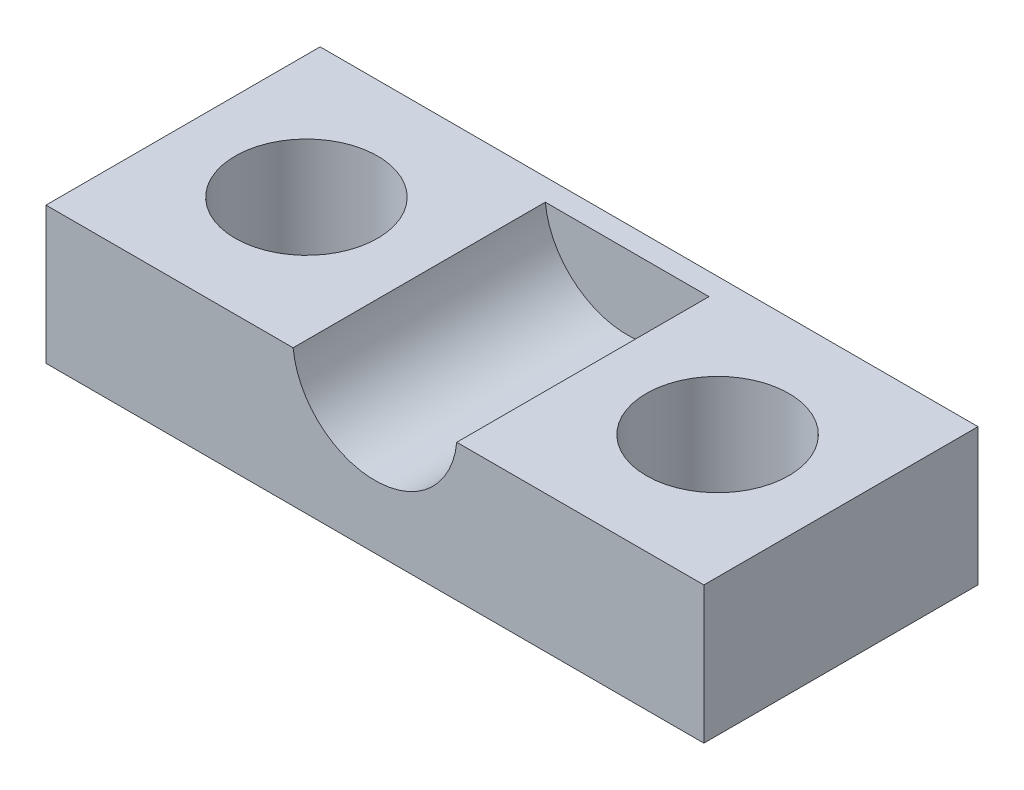
ISO-10303-21;
HEADER;
FILE_DESCRIPTION(('STEP AP214'),'2;1');
FILE_NAME('part.step','',(''),(''),'','','');
FILE_SCHEMA(('AUTOMOTIVE_DESIGN { 1 0 10303 214 1 1 1 1 }'));
ENDSEC;
DATA;
#1=APPLICATION_CONTEXT('core data for automotive mechanical design processes');
#2=APPLICATION_PROTOCOL_DEFINITION('international standard','automotive_design',2000,#1);
#3=PRODUCT_CONTEXT('',#1,'mechanical');
#4=PRODUCT('Part','Part','',(#3));
#5=PRODUCT_RELATED_PRODUCT_CATEGORY('part','',(#4));
#6=PRODUCT_DEFINITION_FORMATION('','',#4);
#7=PRODUCT_DEFINITION_CONTEXT('part definition',#1,'design');
#8=PRODUCT_DEFINITION('design','',#6,#7);
#9=PRODUCT_DEFINITION_SHAPE('','',#8);
#10=(LENGTH_UNIT() NAMED_UNIT(*) SI_UNIT(.MILLI.,.METRE.));
#11=(NAMED_UNIT(*) PLANE_ANGLE_UNIT() SI_UNIT($,.RADIAN.));
#12=(NAMED_UNIT(*) SI_UNIT($,.STERADIAN.) SOLID_ANGLE_UNIT());
#13=UNCERTAINTY_MEASURE_WITH_UNIT(LENGTH_MEASURE(1.E-05),#10,'distance_accuracy_value','');
#14=(GEOMETRIC_REPRESENTATION_CONTEXT(3) GLOBAL_UNCERTAINTY_ASSIGNED_CONTEXT((#13)) GLOBAL_UNIT_ASSIGNED_CONTEXT((#10,
#11,#12)) REPRESENTATION_CONTEXT('',''));
#15=CARTESIAN_POINT('',(0.,0.,0.));
#16=DIRECTION('',(0.,0.,1.));
#17=DIRECTION('',(1.,0.,0.));
#18=AXIS2_PLACEMENT_3D('',#15,#16,#17);
#19=CARTESIAN_POINT('',(0.,5.,0.));
#20=DIRECTION('',(0.,-1.,0.));
#21=DIRECTION('',(0.,0.,-1.));
#22=AXIS2_PLACEMENT_3D('',#19,#20,#21);
#23=PLANE('',#22);
#24=DIRECTION('',(-1.,0.,0.));
#25=VECTOR('',#24,1.);
#26=CARTESIAN_POINT('',(0.,5.,-9.2));
#27=LINE('',#26,#25);
#28=CARTESIAN_POINT('',(14.9849623113118,5.,-9.2));
#29=VERTEX_POINT('',#28);
#30=CARTESIAN_POINT('',(9.01503768866591,5.,-9.2));
#31=VERTEX_POINT('',#30);
#32=EDGE_CURVE('E11',#29,#31,#27,.T.);
#33=ORIENTED_EDGE('',*,*,#32,.F.);
#34=DIRECTION('',(0.,0.,1.));
#35=VECTOR('',#34,1.);
#36=CARTESIAN_POINT('',(14.9849623113118,5.,-9.2));
#37=LINE('',#36,#35);
#38=CARTESIAN_POINT('',(14.9849623113118,5.,0.));
#39=VERTEX_POINT('',#38);
#40=EDGE_CURVE('E101',#29,#39,#37,.T.);
#41=ORIENTED_EDGE('',*,*,#40,.T.);
#42=DIRECTION('',(1.,0.,0.));
#43=VECTOR('',#42,1.);
#44=CARTESIAN_POINT('',(0.,5.,0.));
#45=LINE('',#44,#43);
#46=CARTESIAN_POINT('',(24.,5.,0.));
#47=VERTEX_POINT('',#46);
#48=EDGE_CURVE('E124',#39,#47,#45,.T.);
#49=ORIENTED_EDGE('',*,*,#48,.T.);
#50=DIRECTION('',(0.,0.,-1.));
#51=VECTOR('',#50,1.);
#52=CARTESIAN_POINT('',(24.,5.,0.));
#53=LINE('',#52,#51);
#54=CARTESIAN_POINT('',(24.,5.,-10.));
#55=VERTEX_POINT('',#54);
#56=EDGE_CURVE('E126',#47,#55,#53,.T.);
#57=ORIENTED_EDGE('',*,*,#56,.T.);
#58=DIRECTION('',(-1.,0.,0.));
#59=VECTOR('',#58,1.);
#60=CARTESIAN_POINT('',(0.,5.,-10.));
#61=LINE('',#60,#59);
#62=CARTESIAN_POINT('',(0.,5.,-10.));
#63=VERTEX_POINT('',#62);
#64=EDGE_CURVE('E58',#55,#63,#61,.T.);
#65=ORIENTED_EDGE('',*,*,#64,.T.);
#66=DIRECTION('',(0.,0.,1.));
#67=VECTOR('',#66,1.);
#68=CARTESIAN_POINT('',(0.,5.,0.));
#69=LINE('',#68,#67);
#70=CARTESIAN_POINT('',(0.,5.,0.));
#71=VERTEX_POINT('',#70);
#72=EDGE_CURVE('E122',#63,#71,#69,.T.);
#73=ORIENTED_EDGE('',*,*,#72,.T.);
#74=CARTESIAN_POINT('',(9.01503768866591,5.,0.));
#75=VERTEX_POINT('',#74);
#76=EDGE_CURVE('E86',#71,#75,#45,.T.);
#77=ORIENTED_EDGE('',*,*,#76,.T.);
#78=DIRECTION('',(0.,0.,1.));
#79=VECTOR('',#78,1.);
#80=CARTESIAN_POINT('',(9.01503768866591,5.,-9.2));
#81=LINE('',#80,#79);
#82=EDGE_CURVE('E49',#75,#31,#81,.F.);
#83=ORIENTED_EDGE('',*,*,#82,.T.);
#84=EDGE_LOOP('',(#33,#41,#49,#57,#65,#73,#77,#83));
#85=FACE_BOUND('',#84,.T.);
#86=CARTESIAN_POINT('',(4.5,5.,-4.99999999999992));
#87=DIRECTION('',(0.,1.,0.));
#88=DIRECTION('',(0.,0.,1.));
#89=AXIS2_PLACEMENT_3D('',#86,#87,#88);
#90=CIRCLE('',#89,2.6);
#91=CARTESIAN_POINT('',(4.5,5.,-2.39999999999992));
#92=VERTEX_POINT('',#91);
#93=EDGE_CURVE('E116',#92,#92,#90,.T.);
#94=ORIENTED_EDGE('',*,*,#93,.F.);
#95=EDGE_LOOP('',(#94));
#96=FACE_BOUND('',#95,.T.);
#97=CARTESIAN_POINT('',(19.4999999999998,5.,-4.99999999999987));
#98=DIRECTION('',(0.,1.,0.));
#99=DIRECTION('',(0.,0.,1.));
#100=AXIS2_PLACEMENT_3D('',#97,#98,#99);
#101=CIRCLE('',#100,2.6);
#102=CARTESIAN_POINT('',(19.4999999999998,5.,-2.39999999999987));
#103=VERTEX_POINT('',#102);
#104=EDGE_CURVE('E110',#103,#103,#101,.T.);
#105=ORIENTED_EDGE('',*,*,#104,.F.);
#106=EDGE_LOOP('',(#105));
#107=FACE_BOUND('',#106,.T.);
#108=ADVANCED_FACE('F34',(#85,#96,#107),#23,.F.);
#109=CARTESIAN_POINT('',(0.,0.,0.));
#110=DIRECTION('',(0.,-1.,0.));
#111=DIRECTION('',(0.,0.,-1.));
#112=AXIS2_PLACEMENT_3D('',#109,#110,#111);
#113=PLANE('',#112);
#114=CARTESIAN_POINT('',(4.5,0.,-4.99999999999992));
#115=DIRECTION('',(0.,1.,0.));
#116=DIRECTION('',(0.,0.,1.));
#117=AXIS2_PLACEMENT_3D('',#114,#115,#116);
#118=CIRCLE('',#117,2.6);
#119=CARTESIAN_POINT('',(4.5,0.,-2.39999999999992));
#120=VERTEX_POINT('',#119);
#121=EDGE_CURVE('E113',#120,#120,#118,.T.);
#122=ORIENTED_EDGE('',*,*,#121,.T.);
#123=EDGE_LOOP('',(#122));
#124=FACE_BOUND('',#123,.T.);
#125=DIRECTION('',(0.,0.,1.));
#126=VECTOR('',#125,1.);
#127=CARTESIAN_POINT('',(0.,0.,0.));
#128=LINE('',#127,#126);
#129=CARTESIAN_POINT('',(0.,0.,-10.));
#130=VERTEX_POINT('',#129);
#131=CARTESIAN_POINT('',(0.,0.,0.));
#132=VERTEX_POINT('',#131);
#133=EDGE_CURVE('E119',#130,#132,#128,.T.);
#134=ORIENTED_EDGE('',*,*,#133,.F.);
#135=DIRECTION('',(-1.,0.,0.));
#136=VECTOR('',#135,1.);
#137=CARTESIAN_POINT('',(0.,0.,-10.));
#138=LINE('',#137,#136);
#139=CARTESIAN_POINT('',(24.,0.,-10.));
#140=VERTEX_POINT('',#139);
#141=EDGE_CURVE('E79',#140,#130,#138,.T.);
#142=ORIENTED_EDGE('',*,*,#141,.F.);
#143=DIRECTION('',(0.,0.,-1.));
#144=VECTOR('',#143,1.);
#145=CARTESIAN_POINT('',(24.,0.,0.));
#146=LINE('',#145,#144);
#147=CARTESIAN_POINT('',(24.,0.,0.));
#148=VERTEX_POINT('',#147);
#149=EDGE_CURVE('E134',#148,#140,#146,.T.);
#150=ORIENTED_EDGE('',*,*,#149,.F.);
#151=DIRECTION('',(1.,0.,0.));
#152=VECTOR('',#151,1.);
#153=CARTESIAN_POINT('',(0.,0.,0.));
#154=LINE('',#153,#152);
#155=EDGE_CURVE('E132',#132,#148,#154,.T.);
#156=ORIENTED_EDGE('',*,*,#155,.F.);
#157=EDGE_LOOP('',(#134,#142,#150,#156));
#158=FACE_BOUND('',#157,.T.);
#159=CARTESIAN_POINT('',(19.4999999999998,0.,-4.99999999999987));
#160=DIRECTION('',(0.,1.,0.));
#161=DIRECTION('',(0.,0.,1.));
#162=AXIS2_PLACEMENT_3D('',#159,#160,#161);
#163=CIRCLE('',#162,2.6);
#164=CARTESIAN_POINT('',(19.4999999999998,0.,-2.39999999999987));
#165=VERTEX_POINT('',#164);
#166=EDGE_CURVE('E106',#165,#165,#163,.T.);
#167=ORIENTED_EDGE('',*,*,#166,.T.);
#168=EDGE_LOOP('',(#167));
#169=FACE_BOUND('',#168,.T.);
#170=ADVANCED_FACE('F150',(#124,#158,#169),#113,.T.);
#171=CARTESIAN_POINT('',(0.,5.,0.));
#172=DIRECTION('',(1.,0.,0.));
#173=DIRECTION('',(0.,0.,-1.));
#174=AXIS2_PLACEMENT_3D('',#171,#172,#173);
#175=PLANE('',#174);
#176=ORIENTED_EDGE('',*,*,#133,.T.);
#177=DIRECTION('',(0.,-1.,0.));
#178=VECTOR('',#177,1.);
#179=CARTESIAN_POINT('',(0.,5.,0.));
#180=LINE('',#179,#178);
#181=EDGE_CURVE('E42',#71,#132,#180,.T.);
#182=ORIENTED_EDGE('',*,*,#181,.F.);
#183=ORIENTED_EDGE('',*,*,#72,.F.);
#184=DIRECTION('',(0.,-1.,0.));
#185=VECTOR('',#184,1.);
#186=CARTESIAN_POINT('',(0.,5.,-10.));
#187=LINE('',#186,#185);
#188=EDGE_CURVE('E129',#63,#130,#187,.T.);
#189=ORIENTED_EDGE('',*,*,#188,.T.);
#190=EDGE_LOOP('',(#176,#182,#183,#189));
#191=FACE_BOUND('',#190,.T.);
#192=ADVANCED_FACE('F36',(#191),#175,.F.);
#193=CARTESIAN_POINT('',(0.,5.,0.));
#194=DIRECTION('',(0.,0.,-1.));
#195=DIRECTION('',(-1.,0.,0.));
#196=AXIS2_PLACEMENT_3D('',#193,#194,#195);
#197=PLANE('',#196);
#198=ORIENTED_EDGE('',*,*,#48,.F.);
#199=CARTESIAN_POINT('',(11.9999999999888,5.29999999998876,0.));
#200=DIRECTION('',(0.,0.,1.));
#201=DIRECTION('',(1.,0.,0.));
#202=AXIS2_PLACEMENT_3D('',#199,#200,#201);
#203=CIRCLE('',#202,3.00000000000193);
#204=EDGE_CURVE('E102',#75,#39,#203,.T.);
#205=ORIENTED_EDGE('',*,*,#204,.F.);
#206=ORIENTED_EDGE('',*,*,#76,.F.);
#207=ORIENTED_EDGE('',*,*,#181,.T.);
#208=ORIENTED_EDGE('',*,*,#155,.T.);
#209=DIRECTION('',(0.,-1.,0.));
#210=VECTOR('',#209,1.);
#211=CARTESIAN_POINT('',(24.,5.,0.));
#212=LINE('',#211,#210);
#213=EDGE_CURVE('E140',#47,#148,#212,.T.);
#214=ORIENTED_EDGE('',*,*,#213,.F.);
#215=EDGE_LOOP('',(#198,#205,#206,#207,#208,#214));
#216=FACE_BOUND('',#215,.T.);
#217=ADVANCED_FACE('F144',(#216),#197,.F.);
#218=CARTESIAN_POINT('',(24.,5.,0.));
#219=DIRECTION('',(-1.,0.,0.));
#220=DIRECTION('',(0.,0.,1.));
#221=AXIS2_PLACEMENT_3D('',#218,#219,#220);
#222=PLANE('',#221);
#223=ORIENTED_EDGE('',*,*,#149,.T.);
#224=DIRECTION('',(0.,-1.,0.));
#225=VECTOR('',#224,1.);
#226=CARTESIAN_POINT('',(24.,5.,-10.));
#227=LINE('',#226,#225);
#228=EDGE_CURVE('E138',#55,#140,#227,.T.);
#229=ORIENTED_EDGE('',*,*,#228,.F.);
#230=ORIENTED_EDGE('',*,*,#56,.F.);
#231=ORIENTED_EDGE('',*,*,#213,.T.);
#232=EDGE_LOOP('',(#223,#229,#230,#231));
#233=FACE_BOUND('',#232,.T.);
#234=ADVANCED_FACE('F155',(#233),#222,.F.);
#235=CARTESIAN_POINT('',(0.,5.,-10.));
#236=DIRECTION('',(0.,0.,1.));
#237=DIRECTION('',(1.,0.,0.));
#238=AXIS2_PLACEMENT_3D('',#235,#236,#237);
#239=PLANE('',#238);
#240=ORIENTED_EDGE('',*,*,#141,.T.);
#241=ORIENTED_EDGE('',*,*,#188,.F.);
#242=ORIENTED_EDGE('',*,*,#64,.F.);
#243=ORIENTED_EDGE('',*,*,#228,.T.);
#244=EDGE_LOOP('',(#240,#241,#242,#243));
#245=FACE_BOUND('',#244,.T.);
#246=ADVANCED_FACE('F157',(#245),#239,.F.);
#247=CARTESIAN_POINT('',(4.5,5.,-4.99999999999992));
#248=DIRECTION('',(0.,-1.,0.));
#249=DIRECTION('',(0.,0.,-1.));
#250=AXIS2_PLACEMENT_3D('',#247,#248,#249);
#251=CYLINDRICAL_SURFACE('',#250,2.6);
#252=ORIENTED_EDGE('',*,*,#93,.T.);
#253=EDGE_LOOP('',(#252));
#254=FACE_BOUND('',#253,.T.);
#255=ORIENTED_EDGE('',*,*,#121,.F.);
#256=EDGE_LOOP('',(#255));
#257=FACE_BOUND('',#256,.T.);
#258=ADVANCED_FACE('F159',(#254,#257),#251,.F.);
#259=CARTESIAN_POINT('',(19.4999999999998,5.,-4.99999999999987));
#260=DIRECTION('',(0.,-1.,0.));
#261=DIRECTION('',(0.,0.,-1.));
#262=AXIS2_PLACEMENT_3D('',#259,#260,#261);
#263=CYLINDRICAL_SURFACE('',#262,2.6);
#264=ORIENTED_EDGE('',*,*,#104,.T.);
#265=EDGE_LOOP('',(#264));
#266=FACE_BOUND('',#265,.T.);
#267=ORIENTED_EDGE('',*,*,#166,.F.);
#268=EDGE_LOOP('',(#267));
#269=FACE_BOUND('',#268,.T.);
#270=ADVANCED_FACE('F165',(#266,#269),#263,.F.);
#271=CARTESIAN_POINT('',(11.9999999999888,5.29999999998876,-9.2));
#272=DIRECTION('',(0.,0.,1.));
#273=DIRECTION('',(1.,0.,0.));
#274=AXIS2_PLACEMENT_3D('',#271,#272,#273);
#275=PLANE('',#274);
#276=ORIENTED_EDGE('',*,*,#32,.T.);
#277=CARTESIAN_POINT('',(11.9999999999888,5.29999999998876,-9.2));
#278=DIRECTION('',(0.,0.,1.));
#279=DIRECTION('',(1.,0.,0.));
#280=AXIS2_PLACEMENT_3D('',#277,#278,#279);
#281=CIRCLE('',#280,3.00000000000193);
#282=EDGE_CURVE('E98',#31,#29,#281,.T.);
#283=ORIENTED_EDGE('',*,*,#282,.T.);
#284=EDGE_LOOP('',(#276,#283));
#285=FACE_BOUND('',#284,.T.);
#286=ADVANCED_FACE('F97',(#285),#275,.T.);
#287=CARTESIAN_POINT('',(11.9999999999888,5.29999999998876,-9.2));
#288=DIRECTION('',(0.,0.,1.));
#289=DIRECTION('',(1.,0.,0.));
#290=AXIS2_PLACEMENT_3D('',#287,#288,#289);
#291=CYLINDRICAL_SURFACE('',#290,3.00000000000193);
#292=ORIENTED_EDGE('',*,*,#282,.F.);
#293=ORIENTED_EDGE('',*,*,#82,.F.);
#294=ORIENTED_EDGE('',*,*,#204,.T.);
#295=ORIENTED_EDGE('',*,*,#40,.F.);
#296=EDGE_LOOP('',(#292,#293,#294,#295));
#297=FACE_BOUND('',#296,.T.);
#298=ADVANCED_FACE('F100',(#297),#291,.F.);
#299=CLOSED_SHELL('',(#108,#170,#192,#217,#234,#246,#258,#270,#286,#298));
#300=MANIFOLD_SOLID_BREP('B2',#299);
#301=ADVANCED_BREP_SHAPE_REPRESENTATION('',(#18,#300),#14);
#302=SHAPE_DEFINITION_REPRESENTATION(#9,#301);
ENDSEC;
END-ISO-10303-21;
